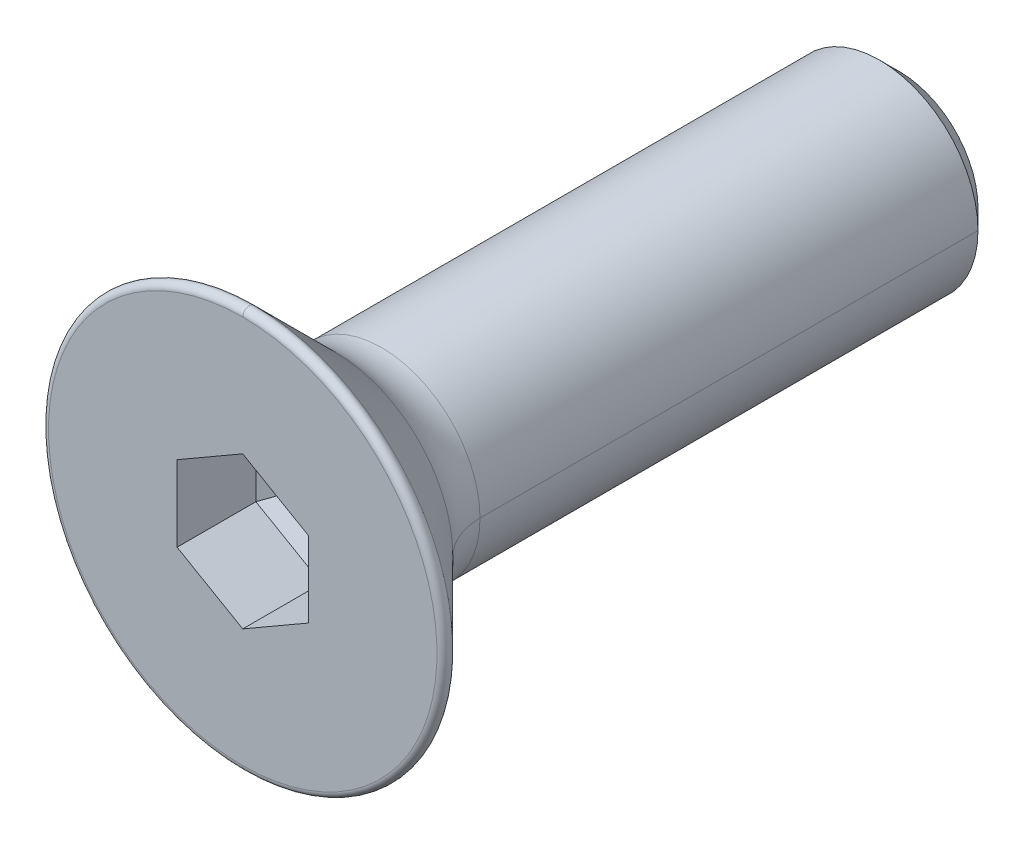
ISO-10303-21;
HEADER;
FILE_DESCRIPTION(('STEP AP214'),'2;1');
FILE_NAME('part.step','',(''),(''),'','','');
FILE_SCHEMA(('AUTOMOTIVE_DESIGN { 1 0 10303 214 1 1 1 1 }'));
ENDSEC;
DATA;
#1=APPLICATION_CONTEXT('core data for automotive mechanical design processes');
#2=APPLICATION_PROTOCOL_DEFINITION('international standard','automotive_design',2000,#1);
#3=PRODUCT_CONTEXT('',#1,'mechanical');
#4=PRODUCT('Part','Part','',(#3));
#5=PRODUCT_RELATED_PRODUCT_CATEGORY('part','',(#4));
#6=PRODUCT_DEFINITION_FORMATION('','',#4);
#7=PRODUCT_DEFINITION_CONTEXT('part definition',#1,'design');
#8=PRODUCT_DEFINITION('design','',#6,#7);
#9=PRODUCT_DEFINITION_SHAPE('','',#8);
#10=(LENGTH_UNIT() NAMED_UNIT(*) SI_UNIT(.MILLI.,.METRE.));
#11=(NAMED_UNIT(*) PLANE_ANGLE_UNIT() SI_UNIT($,.RADIAN.));
#12=(NAMED_UNIT(*) SI_UNIT($,.STERADIAN.) SOLID_ANGLE_UNIT());
#13=UNCERTAINTY_MEASURE_WITH_UNIT(LENGTH_MEASURE(1.E-05),#10,'distance_accuracy_value','');
#14=(GEOMETRIC_REPRESENTATION_CONTEXT(3) GLOBAL_UNCERTAINTY_ASSIGNED_CONTEXT((#13)) GLOBAL_UNIT_ASSIGNED_CONTEXT((#10,
#11,#12)) REPRESENTATION_CONTEXT('',''));
#15=CARTESIAN_POINT('',(0.,0.,0.));
#16=DIRECTION('',(0.,0.,1.));
#17=DIRECTION('',(1.,0.,0.));
#18=AXIS2_PLACEMENT_3D('',#15,#16,#17);
#19=CARTESIAN_POINT('',(0.,0.,0.));
#20=DIRECTION('',(0.,0.,1.));
#21=DIRECTION('',(1.,0.,0.));
#22=AXIS2_PLACEMENT_3D('',#19,#20,#21);
#23=PLANE('',#22);
#24=CARTESIAN_POINT('',(0.,0.,1.221950496344E-07));
#25=DIRECTION('',(0.,0.,-1.));
#26=DIRECTION('',(1.,0.,0.));
#27=AXIS2_PLACEMENT_3D('',#24,#25,#26);
#28=CIRCLE('',#27,1.199999622992);
#29=CARTESIAN_POINT('',(1.199999622992,0.,1.221950496344E-07));
#30=VERTEX_POINT('',#29);
#31=CARTESIAN_POINT('',(-1.199999622992,0.,1.221950496344E-07));
#32=VERTEX_POINT('',#31);
#33=EDGE_CURVE('E11',#30,#32,#28,.T.);
#34=ORIENTED_EDGE('',*,*,#33,.T.);
#35=CARTESIAN_POINT('',(0.,0.,1.221950496344E-07));
#36=DIRECTION('',(0.,0.,-1.));
#37=DIRECTION('',(-1.,0.,0.));
#38=AXIS2_PLACEMENT_3D('',#35,#36,#37);
#39=CIRCLE('',#38,1.199999622992);
#40=EDGE_CURVE('E28',#32,#30,#39,.T.);
#41=ORIENTED_EDGE('',*,*,#40,.T.);
#42=EDGE_LOOP('',(#34,#41));
#43=FACE_BOUND('',#42,.T.);
#44=ADVANCED_FACE('F17',(#43),#23,.F.);
#45=CARTESIAN_POINT('',(0.,0.,0.1500004613423));
#46=DIRECTION('',(0.,0.,1.));
#47=DIRECTION('',(0.,-1.,0.));
#48=AXIS2_PLACEMENT_3D('',#45,#46,#47);
#49=CONICAL_SURFACE('',#48,1.349999899738,0.785397955395941);
#50=DIRECTION('',(-0.707106805699747,2.32738968452416E-11,0.707106756673347));
#51=VECTOR('',#50,1.);
#52=CARTESIAN_POINT('',(-1.199999833587,-1.579898531169E-10,1.663889471389E-07));
#53=LINE('',#52,#51);
#54=CARTESIAN_POINT('',(-1.5,0.,0.3000003227048));
#55=VERTEX_POINT('',#54);
#56=EDGE_CURVE('E261',#32,#55,#53,.T.);
#57=ORIENTED_EDGE('',*,*,#56,.T.);
#58=CARTESIAN_POINT('',(0.,0.,0.3000003227048));
#59=DIRECTION('',(0.,0.,-1.));
#60=DIRECTION('',(-1.,0.,0.));
#61=AXIS2_PLACEMENT_3D('',#58,#59,#60);
#62=CIRCLE('',#61,1.5);
#63=CARTESIAN_POINT('',(1.5,0.,0.3000003227048));
#64=VERTEX_POINT('',#63);
#65=EDGE_CURVE('E257',#55,#64,#62,.T.);
#66=ORIENTED_EDGE('',*,*,#65,.T.);
#67=DIRECTION('',(0.707106805699747,-2.32750386183916E-11,0.707106756673347));
#68=VECTOR('',#67,1.);
#69=CARTESIAN_POINT('',(1.199999833587,1.579905275284E-10,1.663889471389E-07));
#70=LINE('',#69,#68);
#71=EDGE_CURVE('E262',#30,#64,#70,.T.);
#72=ORIENTED_EDGE('',*,*,#71,.F.);
#73=ORIENTED_EDGE('',*,*,#40,.F.);
#74=EDGE_LOOP('',(#57,#66,#72,#73));
#75=FACE_BOUND('',#74,.T.);
#76=ADVANCED_FACE('F545',(#75),#49,.T.);
#77=CARTESIAN_POINT('',(0.,0.,0.1500004613423));
#78=DIRECTION('',(0.,0.,1.));
#79=DIRECTION('',(0.,-1.,0.));
#80=AXIS2_PLACEMENT_3D('',#77,#78,#79);
#81=CONICAL_SURFACE('',#80,1.349999899738,0.785397955395941);
#82=ORIENTED_EDGE('',*,*,#71,.T.);
#83=CARTESIAN_POINT('',(0.,0.,0.3000003227048));
#84=DIRECTION('',(0.,0.,-1.));
#85=DIRECTION('',(1.,0.,0.));
#86=AXIS2_PLACEMENT_3D('',#83,#84,#85);
#87=CIRCLE('',#86,1.5);
#88=EDGE_CURVE('E269',#64,#55,#87,.T.);
#89=ORIENTED_EDGE('',*,*,#88,.T.);
#90=ORIENTED_EDGE('',*,*,#56,.F.);
#91=ORIENTED_EDGE('',*,*,#33,.F.);
#92=EDGE_LOOP('',(#82,#89,#90,#91));
#93=FACE_BOUND('',#92,.T.);
#94=ADVANCED_FACE('F550',(#93),#81,.T.);
#95=CARTESIAN_POINT('',(0.,0.,0.));
#96=DIRECTION('',(0.,0.,1.));
#97=DIRECTION('',(1.,0.,0.));
#98=AXIS2_PLACEMENT_3D('',#95,#96,#97);
#99=CYLINDRICAL_SURFACE('',#98,1.5);
#100=DIRECTION('',(-2.056641517354E-08,1.968408613006E-11,1.));
#101=VECTOR('',#100,1.);
#102=CARTESIAN_POINT('',(-1.499999843988,-1.481155749465E-10,0.3000001559896));
#103=LINE('',#102,#101);
#104=CARTESIAN_POINT('',(-1.5,0.,7.885786437627));
#105=VERTEX_POINT('',#104);
#106=EDGE_CURVE('E280',#55,#105,#103,.T.);
#107=ORIENTED_EDGE('',*,*,#106,.F.);
#108=ORIENTED_EDGE('',*,*,#88,.F.);
#109=DIRECTION('',(2.056641517354E-08,-1.976343078227E-11,1.));
#110=VECTOR('',#109,1.);
#111=CARTESIAN_POINT('',(1.499999843988,1.481157649447E-10,0.3000001559896));
#112=LINE('',#111,#110);
#113=CARTESIAN_POINT('',(1.5,0.,7.885786437627));
#114=VERTEX_POINT('',#113);
#115=EDGE_CURVE('E283',#64,#114,#112,.T.);
#116=ORIENTED_EDGE('',*,*,#115,.T.);
#117=CARTESIAN_POINT('',(0.,0.,7.885786437627));
#118=DIRECTION('',(0.,0.,1.));
#119=DIRECTION('',(0.,-1.,0.));
#120=AXIS2_PLACEMENT_3D('',#117,#118,#119);
#121=CIRCLE('',#120,1.5);
#122=CARTESIAN_POINT('',(0.,-1.5,7.885786437627));
#123=VERTEX_POINT('',#122);
#124=EDGE_CURVE('E276',#123,#114,#121,.T.);
#125=ORIENTED_EDGE('',*,*,#124,.F.);
#126=CARTESIAN_POINT('',(0.,0.,7.885786437627));
#127=DIRECTION('',(0.,0.,1.));
#128=DIRECTION('',(-1.,0.,0.));
#129=AXIS2_PLACEMENT_3D('',#126,#127,#128);
#130=CIRCLE('',#129,1.5);
#131=EDGE_CURVE('E330',#105,#123,#130,.T.);
#132=ORIENTED_EDGE('',*,*,#131,.F.);
#133=EDGE_LOOP('',(#107,#108,#116,#125,#132));
#134=FACE_BOUND('',#133,.T.);
#135=ADVANCED_FACE('F578',(#134),#99,.T.);
#136=CARTESIAN_POINT('',(0.,0.,7.885786437627));
#137=DIRECTION('',(0.,0.,1.));
#138=DIRECTION('',(0.0125362560829906,0.99992141805415,0.));
#139=AXIS2_PLACEMENT_3D('',#136,#137,#138);
#140=TOROIDAL_SURFACE('',#139,2.5,1.);
#141=CARTESIAN_POINT('',(0.,0.,8.592893218813));
#142=DIRECTION('',(0.,0.,1.));
#143=DIRECTION('',(1.,0.,0.));
#144=AXIS2_PLACEMENT_3D('',#141,#142,#143);
#145=CIRCLE('',#144,1.792893218813);
#146=CARTESIAN_POINT('',(1.792893218813,0.,8.592893218813));
#147=VERTEX_POINT('',#146);
#148=CARTESIAN_POINT('',(0.,1.792893218813,8.592893218813));
#149=VERTEX_POINT('',#148);
#150=EDGE_CURVE('E84',#147,#149,#145,.T.);
#151=ORIENTED_EDGE('',*,*,#150,.F.);
#152=CARTESIAN_POINT('',(2.5,-9.56314333278E-11,7.885786437627));
#153=DIRECTION('',(3.82525747189E-11,1.,0.));
#154=DIRECTION('',(-1.,3.82525747189E-11,0.));
#155=AXIS2_PLACEMENT_3D('',#152,#153,#154);
#156=CIRCLE('',#155,1.);
#157=EDGE_CURVE('E279',#114,#147,#156,.T.);
#158=ORIENTED_EDGE('',*,*,#157,.F.);
#159=CARTESIAN_POINT('',(0.,0.,7.885786437627));
#160=DIRECTION('',(0.,0.,-1.));
#161=DIRECTION('',(-1.,0.,0.));
#162=AXIS2_PLACEMENT_3D('',#159,#160,#161);
#163=CIRCLE('',#162,1.5);
#164=EDGE_CURVE('E298',#105,#114,#163,.T.);
#165=ORIENTED_EDGE('',*,*,#164,.F.);
#166=ORIENTED_EDGE('',*,*,#131,.T.);
#167=CARTESIAN_POINT('',(-7.338132185231E-11,-2.5,7.885786437627));
#168=DIRECTION('',(1.,-2.935252908787E-11,0.));
#169=DIRECTION('',(2.935252908787E-11,1.,0.));
#170=AXIS2_PLACEMENT_3D('',#167,#168,#169);
#171=CIRCLE('',#170,1.);
#172=CARTESIAN_POINT('',(0.,-1.792893218813,8.592893218813));
#173=VERTEX_POINT('',#172);
#174=EDGE_CURVE('E237',#123,#173,#171,.T.);
#175=ORIENTED_EDGE('',*,*,#174,.T.);
#176=CARTESIAN_POINT('',(0.,0.,8.592893218813));
#177=DIRECTION('',(0.,0.,1.));
#178=DIRECTION('',(0.,1.,0.));
#179=AXIS2_PLACEMENT_3D('',#176,#177,#178);
#180=CIRCLE('',#179,1.792893218813);
#181=EDGE_CURVE('E234',#149,#173,#180,.T.);
#182=ORIENTED_EDGE('',*,*,#181,.F.);
#183=EDGE_LOOP('',(#151,#158,#165,#166,#175,#182));
#184=FACE_BOUND('',#183,.T.);
#185=ADVANCED_FACE('F311',(#184),#140,.F.);
#186=CARTESIAN_POINT('',(0.,0.,9.211091270347));
#187=DIRECTION('',(0.,0.,1.));
#188=DIRECTION('',(0.,1.,0.));
#189=AXIS2_PLACEMENT_3D('',#186,#187,#188);
#190=CONICAL_SURFACE('',#189,2.411091270347,0.7853981633973);
#191=DIRECTION('',(1.79644141058512E-12,0.707106781186548,0.707106781186548));
#192=VECTOR('',#191,1.);
#193=CARTESIAN_POINT('',(2.846953821252E-13,1.792893218814,8.592893218814));
#194=LINE('',#193,#192);
#195=CARTESIAN_POINT('',(0.,3.029289321881,9.829289321881));
#196=VERTEX_POINT('',#195);
#197=EDGE_CURVE('E287',#149,#196,#194,.T.);
#198=ORIENTED_EDGE('',*,*,#197,.F.);
#199=ORIENTED_EDGE('',*,*,#181,.T.);
#200=DIRECTION('',(-1.71515427391611E-12,-0.707106781186548,0.707106781186548));
#201=VECTOR('',#200,1.);
#202=CARTESIAN_POINT('',(-4.271000713285E-13,-1.792893218814,8.592893218814));
#203=LINE('',#202,#201);
#204=CARTESIAN_POINT('',(0.,-3.029289321881,9.829289321881));
#205=VERTEX_POINT('',#204);
#206=EDGE_CURVE('E76',#173,#205,#203,.T.);
#207=ORIENTED_EDGE('',*,*,#206,.T.);
#208=CARTESIAN_POINT('',(0.,0.,9.829289321881));
#209=DIRECTION('',(0.,0.,1.));
#210=DIRECTION('',(0.,1.,0.));
#211=AXIS2_PLACEMENT_3D('',#208,#209,#210);
#212=CIRCLE('',#211,3.029289321881);
#213=EDGE_CURVE('E251',#196,#205,#212,.T.);
#214=ORIENTED_EDGE('',*,*,#213,.F.);
#215=EDGE_LOOP('',(#198,#199,#207,#214));
#216=FACE_BOUND('',#215,.T.);
#217=ADVANCED_FACE('F528',(#216),#190,.T.);
#218=CARTESIAN_POINT('',(0.,0.,9.9));
#219=DIRECTION('',(0.,0.,-1.));
#220=DIRECTION('',(0.01180088913869,0.999930367083397,0.));
#221=AXIS2_PLACEMENT_3D('',#218,#219,#220);
#222=TOROIDAL_SURFACE('',#221,2.958578643763,0.1);
#223=CARTESIAN_POINT('',(0.,2.958578643763,9.9));
#224=DIRECTION('',(-1.,0.,0.));
#225=DIRECTION('',(0.,0.,1.));
#226=AXIS2_PLACEMENT_3D('',#223,#224,#225);
#227=CIRCLE('',#226,0.1);
#228=CARTESIAN_POINT('',(0.,2.958578643763,10.));
#229=VERTEX_POINT('',#228);
#230=EDGE_CURVE('E247',#229,#196,#227,.T.);
#231=ORIENTED_EDGE('',*,*,#230,.T.);
#232=ORIENTED_EDGE('',*,*,#213,.T.);
#233=CARTESIAN_POINT('',(0.,-2.958578643763,9.9));
#234=DIRECTION('',(1.,0.,0.));
#235=DIRECTION('',(0.,0.,1.));
#236=AXIS2_PLACEMENT_3D('',#233,#234,#235);
#237=CIRCLE('',#236,0.1);
#238=CARTESIAN_POINT('',(0.,-2.958578643763,10.));
#239=VERTEX_POINT('',#238);
#240=EDGE_CURVE('E97',#239,#205,#237,.T.);
#241=ORIENTED_EDGE('',*,*,#240,.F.);
#242=CARTESIAN_POINT('',(0.,0.,10.));
#243=DIRECTION('',(0.,0.,1.));
#244=DIRECTION('',(0.,1.,0.));
#245=AXIS2_PLACEMENT_3D('',#242,#243,#244);
#246=CIRCLE('',#245,2.958578643763);
#247=EDGE_CURVE('E296',#229,#239,#246,.T.);
#248=ORIENTED_EDGE('',*,*,#247,.F.);
#249=EDGE_LOOP('',(#231,#232,#241,#248));
#250=FACE_BOUND('',#249,.T.);
#251=ADVANCED_FACE('F523',(#250),#222,.T.);
#252=CARTESIAN_POINT('',(0.,0.,10.));
#253=DIRECTION('',(0.,0.,-1.));
#254=DIRECTION('',(0.,-1.,0.));
#255=AXIS2_PLACEMENT_3D('',#252,#253,#254);
#256=PLANE('',#255);
#257=ORIENTED_EDGE('',*,*,#247,.T.);
#258=CARTESIAN_POINT('',(0.,0.,10.));
#259=DIRECTION('',(0.,0.,1.));
#260=DIRECTION('',(0.,-1.,0.));
#261=AXIS2_PLACEMENT_3D('',#258,#259,#260);
#262=CIRCLE('',#261,2.958578643763);
#263=EDGE_CURVE('E344',#239,#229,#262,.T.);
#264=ORIENTED_EDGE('',*,*,#263,.T.);
#265=EDGE_LOOP('',(#257,#264));
#266=FACE_BOUND('',#265,.T.);
#267=DIRECTION('',(0.866025403784429,-0.500000000000017,0.));
#268=VECTOR('',#267,1.);
#269=CARTESIAN_POINT('',(-1.,-0.5773502691896,10.));
#270=LINE('',#269,#268);
#271=CARTESIAN_POINT('',(-1.,-0.5773502691896,10.));
#272=VERTEX_POINT('',#271);
#273=CARTESIAN_POINT('',(0.,-1.154700538379,10.));
#274=VERTEX_POINT('',#273);
#275=EDGE_CURVE('E118',#272,#274,#270,.T.);
#276=ORIENTED_EDGE('',*,*,#275,.F.);
#277=DIRECTION('',(0.,-1.,0.));
#278=VECTOR('',#277,1.);
#279=CARTESIAN_POINT('',(-1.,0.5773502691896,10.));
#280=LINE('',#279,#278);
#281=CARTESIAN_POINT('',(-1.,0.5773502691896,10.));
#282=VERTEX_POINT('',#281);
#283=EDGE_CURVE('E227',#282,#272,#280,.T.);
#284=ORIENTED_EDGE('',*,*,#283,.F.);
#285=DIRECTION('',(-0.866025403784429,-0.500000000000017,0.));
#286=VECTOR('',#285,1.);
#287=CARTESIAN_POINT('',(0.,1.154700538379,10.));
#288=LINE('',#287,#286);
#289=CARTESIAN_POINT('',(0.,1.154700538379,10.));
#290=VERTEX_POINT('',#289);
#291=EDGE_CURVE('E21',#290,#282,#288,.T.);
#292=ORIENTED_EDGE('',*,*,#291,.F.);
#293=DIRECTION('',(-0.866025403784429,0.500000000000017,0.));
#294=VECTOR('',#293,1.);
#295=CARTESIAN_POINT('',(1.,0.5773502691896,10.));
#296=LINE('',#295,#294);
#297=CARTESIAN_POINT('',(1.,0.5773502691896,10.));
#298=VERTEX_POINT('',#297);
#299=EDGE_CURVE('E198',#298,#290,#296,.T.);
#300=ORIENTED_EDGE('',*,*,#299,.F.);
#301=DIRECTION('',(0.,1.,0.));
#302=VECTOR('',#301,1.);
#303=CARTESIAN_POINT('',(1.,-0.5773502691896,10.));
#304=LINE('',#303,#302);
#305=CARTESIAN_POINT('',(1.,-0.5773502691896,10.));
#306=VERTEX_POINT('',#305);
#307=EDGE_CURVE('E183',#306,#298,#304,.T.);
#308=ORIENTED_EDGE('',*,*,#307,.F.);
#309=DIRECTION('',(0.866025403784429,0.500000000000017,0.));
#310=VECTOR('',#309,1.);
#311=CARTESIAN_POINT('',(0.,-1.154700538379,10.));
#312=LINE('',#311,#310);
#313=EDGE_CURVE('E265',#274,#306,#312,.T.);
#314=ORIENTED_EDGE('',*,*,#313,.F.);
#315=EDGE_LOOP('',(#276,#284,#292,#300,#308,#314));
#316=FACE_BOUND('',#315,.T.);
#317=ADVANCED_FACE('F199',(#266,#316),#256,.F.);
#318=CARTESIAN_POINT('',(0.,-1.154700538379,10.));
#319=DIRECTION('',(0.500000000000017,-0.866025403784429,0.));
#320=DIRECTION('',(0.,0.,-1.));
#321=AXIS2_PLACEMENT_3D('',#318,#319,#320);
#322=PLANE('',#321);
#323=DIRECTION('',(0.,0.,-1.));
#324=VECTOR('',#323,1.);
#325=CARTESIAN_POINT('',(0.,-1.154700538379,10.));
#326=LINE('',#325,#324);
#327=CARTESIAN_POINT('',(0.,-1.154700538379,8.8));
#328=VERTEX_POINT('',#327);
#329=EDGE_CURVE('E230',#274,#328,#326,.T.);
#330=ORIENTED_EDGE('',*,*,#329,.F.);
#331=ORIENTED_EDGE('',*,*,#313,.T.);
#332=DIRECTION('',(0.,0.,-1.));
#333=VECTOR('',#332,1.);
#334=CARTESIAN_POINT('',(1.,-0.5773502691896,10.));
#335=LINE('',#334,#333);
#336=CARTESIAN_POINT('',(1.,-0.5773502691896,8.8));
#337=VERTEX_POINT('',#336);
#338=EDGE_CURVE('E191',#306,#337,#335,.T.);
#339=ORIENTED_EDGE('',*,*,#338,.T.);
#340=DIRECTION('',(0.866025403784429,0.500000000000017,0.));
#341=VECTOR('',#340,1.);
#342=CARTESIAN_POINT('',(0.,-1.154700538379,8.8));
#343=LINE('',#342,#341);
#344=EDGE_CURVE('E252',#328,#337,#343,.T.);
#345=ORIENTED_EDGE('',*,*,#344,.F.);
#346=EDGE_LOOP('',(#330,#331,#339,#345));
#347=FACE_BOUND('',#346,.T.);
#348=ADVANCED_FACE('F596',(#347),#322,.F.);
#349=CARTESIAN_POINT('',(0.2608253175473,-0.4517627018922,8.5));
#350=DIRECTION('',(0.265656082646606,-0.46012983248361,-0.847176122781718));
#351=DIRECTION('',(0.,-0.878751543029884,0.477279504716678));
#352=AXIS2_PLACEMENT_3D('',#349,#350,#351);
#353=PLANE('',#352);
#354=DIRECTION('',(0.761021159878637,-0.439375771514922,0.477279504716724));
#355=VECTOR('',#354,1.);
#356=CARTESIAN_POINT('',(0.04330127018922,-0.025,8.2));
#357=LINE('',#356,#355);
#358=CARTESIAN_POINT('',(0.04330127018922,-0.025,8.2));
#359=VERTEX_POINT('',#358);
#360=EDGE_CURVE('E132',#359,#337,#357,.T.);
#361=ORIENTED_EDGE('',*,*,#360,.F.);
#362=DIRECTION('',(0.866025403784429,0.500000000000017,0.));
#363=VECTOR('',#362,1.);
#364=CARTESIAN_POINT('',(0.,-0.05,8.2));
#365=LINE('',#364,#363);
#366=CARTESIAN_POINT('',(0.,-0.05,8.2));
#367=VERTEX_POINT('',#366);
#368=EDGE_CURVE('E364',#367,#359,#365,.T.);
#369=ORIENTED_EDGE('',*,*,#368,.F.);
#370=DIRECTION('',(0.,-0.878751543029879,0.477279504716689));
#371=VECTOR('',#370,1.);
#372=CARTESIAN_POINT('',(0.,-0.05,8.2));
#373=LINE('',#372,#371);
#374=EDGE_CURVE('E255',#367,#328,#373,.T.);
#375=ORIENTED_EDGE('',*,*,#374,.T.);
#376=ORIENTED_EDGE('',*,*,#344,.T.);
#377=EDGE_LOOP('',(#361,#369,#375,#376));
#378=FACE_BOUND('',#377,.T.);
#379=ADVANCED_FACE('F508',(#378),#353,.F.);
#380=CARTESIAN_POINT('',(-0.2608253175473,-0.4517627018922,8.5));
#381=DIRECTION('',(-0.265656082646606,-0.46012983248361,-0.847176122781718));
#382=DIRECTION('',(0.,-0.878751543029884,0.477279504716678));
#383=AXIS2_PLACEMENT_3D('',#380,#381,#382);
#384=PLANE('',#383);
#385=ORIENTED_EDGE('',*,*,#374,.F.);
#386=DIRECTION('',(0.866025403784429,-0.500000000000017,0.));
#387=VECTOR('',#386,1.);
#388=CARTESIAN_POINT('',(-0.04330127018922,-0.025,8.2));
#389=LINE('',#388,#387);
#390=CARTESIAN_POINT('',(-0.04330127018922,-0.025,8.2));
#391=VERTEX_POINT('',#390);
#392=EDGE_CURVE('E275',#391,#367,#389,.T.);
#393=ORIENTED_EDGE('',*,*,#392,.F.);
#394=DIRECTION('',(-0.761021159878637,-0.439375771514922,0.477279504716724));
#395=VECTOR('',#394,1.);
#396=CARTESIAN_POINT('',(-0.04330127018922,-0.025,8.2));
#397=LINE('',#396,#395);
#398=CARTESIAN_POINT('',(-1.,-0.5773502691896,8.8));
#399=VERTEX_POINT('',#398);
#400=EDGE_CURVE('E256',#391,#399,#397,.T.);
#401=ORIENTED_EDGE('',*,*,#400,.T.);
#402=DIRECTION('',(0.866025403784429,-0.500000000000017,0.));
#403=VECTOR('',#402,1.);
#404=CARTESIAN_POINT('',(-1.,-0.5773502691896,8.8));
#405=LINE('',#404,#403);
#406=EDGE_CURVE('E335',#399,#328,#405,.T.);
#407=ORIENTED_EDGE('',*,*,#406,.T.);
#408=EDGE_LOOP('',(#385,#393,#401,#407));
#409=FACE_BOUND('',#408,.T.);
#410=ADVANCED_FACE('F383',(#409),#384,.F.);
#411=CARTESIAN_POINT('',(-1.,-0.5773502691896,10.));
#412=DIRECTION('',(-0.500000000000017,-0.866025403784429,0.));
#413=DIRECTION('',(-0.866025403784429,0.500000000000017,0.));
#414=AXIS2_PLACEMENT_3D('',#411,#412,#413);
#415=PLANE('',#414);
#416=DIRECTION('',(0.,0.,-1.));
#417=VECTOR('',#416,1.);
#418=CARTESIAN_POINT('',(-1.,-0.5773502691896,10.));
#419=LINE('',#418,#417);
#420=EDGE_CURVE('E231',#272,#399,#419,.T.);
#421=ORIENTED_EDGE('',*,*,#420,.F.);
#422=ORIENTED_EDGE('',*,*,#275,.T.);
#423=ORIENTED_EDGE('',*,*,#329,.T.);
#424=ORIENTED_EDGE('',*,*,#406,.F.);
#425=EDGE_LOOP('',(#421,#422,#423,#424));
#426=FACE_BOUND('',#425,.T.);
#427=ADVANCED_FACE('F376',(#426),#415,.F.);
#428=CARTESIAN_POINT('',(-1.,0.5773502691896,10.));
#429=DIRECTION('',(-1.,0.,0.));
#430=DIRECTION('',(0.,0.,1.));
#431=AXIS2_PLACEMENT_3D('',#428,#429,#430);
#432=PLANE('',#431);
#433=DIRECTION('',(0.,0.,-1.));
#434=VECTOR('',#433,1.);
#435=CARTESIAN_POINT('',(-1.,0.5773502691896,10.));
#436=LINE('',#435,#434);
#437=CARTESIAN_POINT('',(-1.,0.5773502691896,8.8));
#438=VERTEX_POINT('',#437);
#439=EDGE_CURVE('E206',#282,#438,#436,.T.);
#440=ORIENTED_EDGE('',*,*,#439,.F.);
#441=ORIENTED_EDGE('',*,*,#283,.T.);
#442=ORIENTED_EDGE('',*,*,#420,.T.);
#443=DIRECTION('',(0.,-1.,0.));
#444=VECTOR('',#443,1.);
#445=CARTESIAN_POINT('',(-1.,0.5773502691896,8.8));
#446=LINE('',#445,#444);
#447=EDGE_CURVE('E241',#438,#399,#446,.T.);
#448=ORIENTED_EDGE('',*,*,#447,.F.);
#449=EDGE_LOOP('',(#440,#441,#442,#448));
#450=FACE_BOUND('',#449,.T.);
#451=ADVANCED_FACE('F375',(#450),#432,.F.);
#452=CARTESIAN_POINT('',(-0.5216506350946,0.,8.5));
#453=DIRECTION('',(-0.531312165293205,0.,-0.847176122781707));
#454=DIRECTION('',(-0.847176122781707,0.,0.531312165293205));
#455=AXIS2_PLACEMENT_3D('',#452,#453,#454);
#456=PLANE('',#455);
#457=ORIENTED_EDGE('',*,*,#400,.F.);
#458=DIRECTION('',(0.,-1.,0.));
#459=VECTOR('',#458,1.);
#460=CARTESIAN_POINT('',(-0.04330127018922,0.025,8.2));
#461=LINE('',#460,#459);
#462=CARTESIAN_POINT('',(-0.04330127018922,0.025,8.2));
#463=VERTEX_POINT('',#462);
#464=EDGE_CURVE('E270',#463,#391,#461,.T.);
#465=ORIENTED_EDGE('',*,*,#464,.F.);
#466=DIRECTION('',(-0.761021159878637,0.439375771514922,0.477279504716724));
#467=VECTOR('',#466,1.);
#468=CARTESIAN_POINT('',(-0.04330127018922,0.025,8.2));
#469=LINE('',#468,#467);
#470=EDGE_CURVE('E245',#463,#438,#469,.T.);
#471=ORIENTED_EDGE('',*,*,#470,.T.);
#472=ORIENTED_EDGE('',*,*,#447,.T.);
#473=EDGE_LOOP('',(#457,#465,#471,#472));
#474=FACE_BOUND('',#473,.T.);
#475=ADVANCED_FACE('F19',(#474),#456,.F.);
#476=CARTESIAN_POINT('',(-0.2608253175473,0.4517627018922,8.5));
#477=DIRECTION('',(-0.265656082646606,0.46012983248361,-0.847176122781718));
#478=DIRECTION('',(-0.954186581645934,0.,0.299212244747516));
#479=AXIS2_PLACEMENT_3D('',#476,#477,#478);
#480=PLANE('',#479);
#481=ORIENTED_EDGE('',*,*,#470,.F.);
#482=DIRECTION('',(-0.866025403784429,-0.500000000000017,0.));
#483=VECTOR('',#482,1.);
#484=CARTESIAN_POINT('',(0.,0.05,8.2));
#485=LINE('',#484,#483);
#486=CARTESIAN_POINT('',(0.,0.05,8.2));
#487=VERTEX_POINT('',#486);
#488=EDGE_CURVE('E274',#487,#463,#485,.T.);
#489=ORIENTED_EDGE('',*,*,#488,.F.);
#490=DIRECTION('',(0.,0.878751543029879,0.477279504716689));
#491=VECTOR('',#490,1.);
#492=CARTESIAN_POINT('',(0.,0.05,8.2));
#493=LINE('',#492,#491);
#494=CARTESIAN_POINT('',(0.,1.154700538379,8.8));
#495=VERTEX_POINT('',#494);
#496=EDGE_CURVE('E246',#487,#495,#493,.T.);
#497=ORIENTED_EDGE('',*,*,#496,.T.);
#498=DIRECTION('',(-0.866025403784429,-0.500000000000017,0.));
#499=VECTOR('',#498,1.);
#500=CARTESIAN_POINT('',(0.,1.154700538379,8.8));
#501=LINE('',#500,#499);
#502=EDGE_CURVE('E293',#495,#438,#501,.T.);
#503=ORIENTED_EDGE('',*,*,#502,.T.);
#504=EDGE_LOOP('',(#481,#489,#497,#503));
#505=FACE_BOUND('',#504,.T.);
#506=ADVANCED_FACE('F388',(#505),#480,.F.);
#507=CARTESIAN_POINT('',(0.,1.154700538379,10.));
#508=DIRECTION('',(-0.500000000000017,0.866025403784429,0.));
#509=DIRECTION('',(0.,0.,1.));
#510=AXIS2_PLACEMENT_3D('',#507,#508,#509);
#511=PLANE('',#510);
#512=DIRECTION('',(0.,0.,-1.));
#513=VECTOR('',#512,1.);
#514=CARTESIAN_POINT('',(0.,1.154700538379,10.));
#515=LINE('',#514,#513);
#516=EDGE_CURVE('E207',#290,#495,#515,.T.);
#517=ORIENTED_EDGE('',*,*,#516,.F.);
#518=ORIENTED_EDGE('',*,*,#291,.T.);
#519=ORIENTED_EDGE('',*,*,#439,.T.);
#520=ORIENTED_EDGE('',*,*,#502,.F.);
#521=EDGE_LOOP('',(#517,#518,#519,#520));
#522=FACE_BOUND('',#521,.T.);
#523=ADVANCED_FACE('F391',(#522),#511,.F.);
#524=CARTESIAN_POINT('',(1.,0.5773502691896,10.));
#525=DIRECTION('',(0.500000000000017,0.866025403784429,0.));
#526=DIRECTION('',(0.,0.,-1.));
#527=AXIS2_PLACEMENT_3D('',#524,#525,#526);
#528=PLANE('',#527);
#529=DIRECTION('',(0.,0.,-1.));
#530=VECTOR('',#529,1.);
#531=CARTESIAN_POINT('',(1.,0.5773502691896,10.));
#532=LINE('',#531,#530);
#533=CARTESIAN_POINT('',(1.,0.5773502691896,8.8));
#534=VERTEX_POINT('',#533);
#535=EDGE_CURVE('E188',#298,#534,#532,.T.);
#536=ORIENTED_EDGE('',*,*,#535,.F.);
#537=ORIENTED_EDGE('',*,*,#299,.T.);
#538=ORIENTED_EDGE('',*,*,#516,.T.);
#539=DIRECTION('',(-0.866025403784429,0.500000000000017,0.));
#540=VECTOR('',#539,1.);
#541=CARTESIAN_POINT('',(1.,0.5773502691896,8.8));
#542=LINE('',#541,#540);
#543=EDGE_CURVE('E211',#534,#495,#542,.T.);
#544=ORIENTED_EDGE('',*,*,#543,.F.);
#545=EDGE_LOOP('',(#536,#537,#538,#544));
#546=FACE_BOUND('',#545,.T.);
#547=ADVANCED_FACE('F209',(#546),#528,.F.);
#548=CARTESIAN_POINT('',(0.2608253175473,0.4517627018922,8.5));
#549=DIRECTION('',(0.265656082646606,0.46012983248361,-0.847176122781718));
#550=DIRECTION('',(-0.954186581645934,0.,-0.299212244747516));
#551=AXIS2_PLACEMENT_3D('',#548,#549,#550);
#552=PLANE('',#551);
#553=ORIENTED_EDGE('',*,*,#496,.F.);
#554=DIRECTION('',(-0.866025403784429,0.500000000000017,0.));
#555=VECTOR('',#554,1.);
#556=CARTESIAN_POINT('',(0.04330127018922,0.025,8.2));
#557=LINE('',#556,#555);
#558=CARTESIAN_POINT('',(0.04330127018922,0.025,8.2));
#559=VERTEX_POINT('',#558);
#560=EDGE_CURVE('E220',#559,#487,#557,.T.);
#561=ORIENTED_EDGE('',*,*,#560,.F.);
#562=DIRECTION('',(0.761021159878637,0.439375771514922,0.477279504716724));
#563=VECTOR('',#562,1.);
#564=CARTESIAN_POINT('',(0.04330127018922,0.025,8.2));
#565=LINE('',#564,#563);
#566=EDGE_CURVE('E240',#559,#534,#565,.T.);
#567=ORIENTED_EDGE('',*,*,#566,.T.);
#568=ORIENTED_EDGE('',*,*,#543,.T.);
#569=EDGE_LOOP('',(#553,#561,#567,#568));
#570=FACE_BOUND('',#569,.T.);
#571=ADVANCED_FACE('F539',(#570),#552,.F.);
#572=CARTESIAN_POINT('',(0.5216506350946,0.,8.5));
#573=DIRECTION('',(0.531312165293205,0.,-0.847176122781707));
#574=DIRECTION('',(0.,-1.,0.));
#575=AXIS2_PLACEMENT_3D('',#572,#573,#574);
#576=PLANE('',#575);
#577=ORIENTED_EDGE('',*,*,#566,.F.);
#578=DIRECTION('',(0.,1.,0.));
#579=VECTOR('',#578,1.);
#580=CARTESIAN_POINT('',(0.04330127018922,-0.025,8.2));
#581=LINE('',#580,#579);
#582=EDGE_CURVE('E214',#359,#559,#581,.T.);
#583=ORIENTED_EDGE('',*,*,#582,.F.);
#584=ORIENTED_EDGE('',*,*,#360,.T.);
#585=DIRECTION('',(0.,1.,0.));
#586=VECTOR('',#585,1.);
#587=CARTESIAN_POINT('',(1.,-0.5773502691896,8.8));
#588=LINE('',#587,#586);
#589=EDGE_CURVE('E195',#337,#534,#588,.T.);
#590=ORIENTED_EDGE('',*,*,#589,.T.);
#591=EDGE_LOOP('',(#577,#583,#584,#590));
#592=FACE_BOUND('',#591,.T.);
#593=ADVANCED_FACE('F497',(#592),#576,.F.);
#594=CARTESIAN_POINT('',(1.,-0.5773502691896,10.));
#595=DIRECTION('',(1.,0.,0.));
#596=DIRECTION('',(0.,1.,0.));
#597=AXIS2_PLACEMENT_3D('',#594,#595,#596);
#598=PLANE('',#597);
#599=ORIENTED_EDGE('',*,*,#338,.F.);
#600=ORIENTED_EDGE('',*,*,#307,.T.);
#601=ORIENTED_EDGE('',*,*,#535,.T.);
#602=ORIENTED_EDGE('',*,*,#589,.F.);
#603=EDGE_LOOP('',(#599,#600,#601,#602));
#604=FACE_BOUND('',#603,.T.);
#605=ADVANCED_FACE('F185',(#604),#598,.F.);
#606=CARTESIAN_POINT('',(0.,0.,8.2));
#607=DIRECTION('',(0.,0.,1.));
#608=DIRECTION('',(1.,0.,0.));
#609=AXIS2_PLACEMENT_3D('',#606,#607,#608);
#610=PLANE('',#609);
#611=ORIENTED_EDGE('',*,*,#582,.T.);
#612=ORIENTED_EDGE('',*,*,#560,.T.);
#613=ORIENTED_EDGE('',*,*,#488,.T.);
#614=ORIENTED_EDGE('',*,*,#464,.T.);
#615=ORIENTED_EDGE('',*,*,#392,.T.);
#616=ORIENTED_EDGE('',*,*,#368,.T.);
#617=EDGE_LOOP('',(#611,#612,#613,#614,#615,#616));
#618=FACE_BOUND('',#617,.T.);
#619=ADVANCED_FACE('F496',(#618),#610,.T.);
#620=CARTESIAN_POINT('',(0.,0.,9.9));
#621=DIRECTION('',(0.,0.,-1.));
#622=DIRECTION('',(-0.01180088913869,-0.999930367083397,0.));
#623=AXIS2_PLACEMENT_3D('',#620,#621,#622);
#624=TOROIDAL_SURFACE('',#623,2.958578643763,0.1);
#625=ORIENTED_EDGE('',*,*,#240,.T.);
#626=CARTESIAN_POINT('',(0.,0.,9.829289321881));
#627=DIRECTION('',(0.,0.,1.));
#628=DIRECTION('',(0.,-1.,0.));
#629=AXIS2_PLACEMENT_3D('',#626,#627,#628);
#630=CIRCLE('',#629,3.029289321881);
#631=EDGE_CURVE('E318',#205,#196,#630,.T.);
#632=ORIENTED_EDGE('',*,*,#631,.T.);
#633=ORIENTED_EDGE('',*,*,#230,.F.);
#634=ORIENTED_EDGE('',*,*,#263,.F.);
#635=EDGE_LOOP('',(#625,#632,#633,#634));
#636=FACE_BOUND('',#635,.T.);
#637=ADVANCED_FACE('F517',(#636),#624,.T.);
#638=CARTESIAN_POINT('',(0.,0.,9.211091270347));
#639=DIRECTION('',(0.,0.,1.));
#640=DIRECTION('',(0.,1.,0.));
#641=AXIS2_PLACEMENT_3D('',#638,#639,#640);
#642=CONICAL_SURFACE('',#641,2.411091270347,0.7853981633973);
#643=ORIENTED_EDGE('',*,*,#206,.F.);
#644=CARTESIAN_POINT('',(0.,0.,8.592893218813));
#645=DIRECTION('',(0.,0.,1.));
#646=DIRECTION('',(0.,-1.,0.));
#647=AXIS2_PLACEMENT_3D('',#644,#645,#646);
#648=CIRCLE('',#647,1.792893218813);
#649=EDGE_CURVE('E306',#173,#147,#648,.T.);
#650=ORIENTED_EDGE('',*,*,#649,.T.);
#651=ORIENTED_EDGE('',*,*,#150,.T.);
#652=ORIENTED_EDGE('',*,*,#197,.T.);
#653=ORIENTED_EDGE('',*,*,#631,.F.);
#654=EDGE_LOOP('',(#643,#650,#651,#652,#653));
#655=FACE_BOUND('',#654,.T.);
#656=ADVANCED_FACE('F316',(#655),#642,.T.);
#657=CARTESIAN_POINT('',(0.,0.,7.885786437627));
#658=DIRECTION('',(0.,0.,1.));
#659=DIRECTION('',(-0.0125362560829906,-0.99992141805415,0.));
#660=AXIS2_PLACEMENT_3D('',#657,#658,#659);
#661=TOROIDAL_SURFACE('',#660,2.5,1.);
#662=ORIENTED_EDGE('',*,*,#157,.T.);
#663=ORIENTED_EDGE('',*,*,#649,.F.);
#664=ORIENTED_EDGE('',*,*,#174,.F.);
#665=ORIENTED_EDGE('',*,*,#124,.T.);
#666=EDGE_LOOP('',(#662,#663,#664,#665));
#667=FACE_BOUND('',#666,.T.);
#668=ADVANCED_FACE('F304',(#667),#661,.F.);
#669=CARTESIAN_POINT('',(0.,0.,0.));
#670=DIRECTION('',(0.,0.,1.));
#671=DIRECTION('',(1.,0.,0.));
#672=AXIS2_PLACEMENT_3D('',#669,#670,#671);
#673=CYLINDRICAL_SURFACE('',#672,1.5);
#674=ORIENTED_EDGE('',*,*,#115,.F.);
#675=ORIENTED_EDGE('',*,*,#65,.F.);
#676=ORIENTED_EDGE('',*,*,#106,.T.);
#677=ORIENTED_EDGE('',*,*,#164,.T.);
#678=EDGE_LOOP('',(#674,#675,#676,#677));
#679=FACE_BOUND('',#678,.T.);
#680=ADVANCED_FACE('F560',(#679),#673,.T.);
#681=CLOSED_SHELL('',(#44,#76,#94,#135,#185,#217,#251,#317,#348,#379,#410,#427,#451,#475,#506,
#523,#547,#571,#593,#605,#619,#637,#656,#668,#680));
#682=MANIFOLD_SOLID_BREP('B1',#681);
#683=ADVANCED_BREP_SHAPE_REPRESENTATION('',(#18,#682),#14);
#684=SHAPE_DEFINITION_REPRESENTATION(#9,#683);
ENDSEC;
END-ISO-10303-21;
